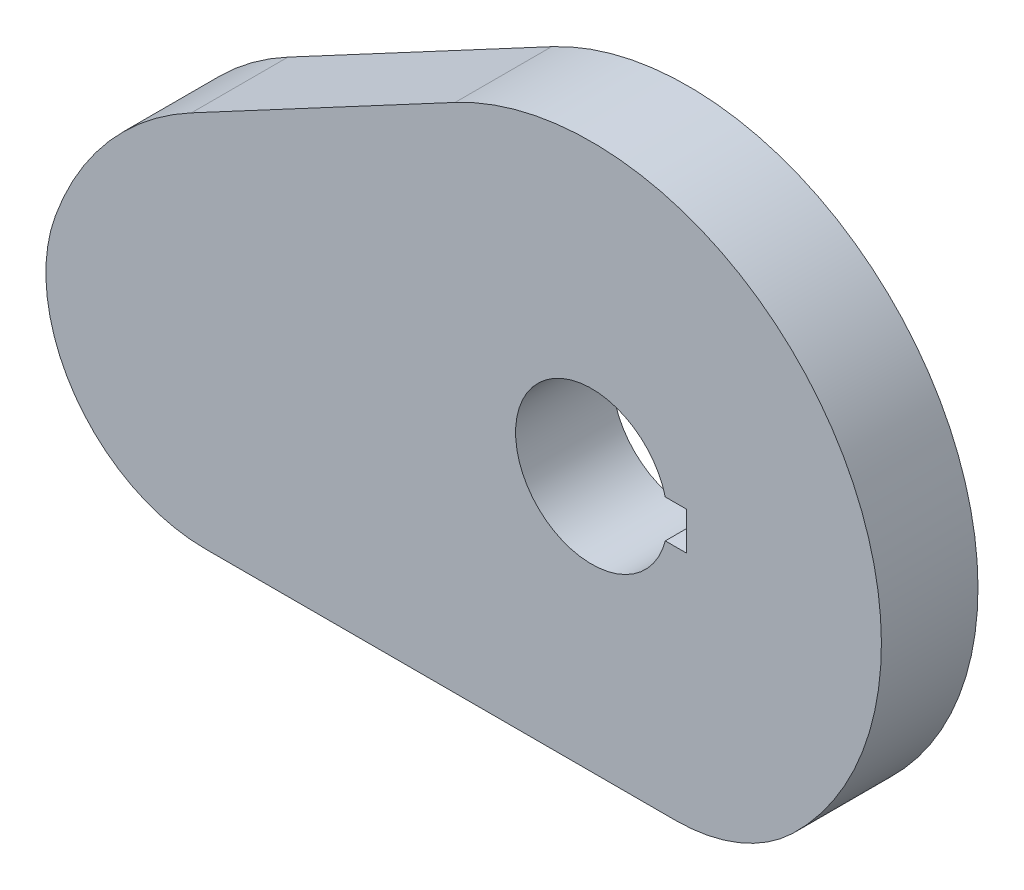
ISO-10303-21;
HEADER;
FILE_DESCRIPTION(('STEP AP214'),'2;1');
FILE_NAME('part.step','',(''),(''),'','','');
FILE_SCHEMA(('AUTOMOTIVE_DESIGN { 1 0 10303 214 1 1 1 1 }'));
ENDSEC;
DATA;
#1=APPLICATION_CONTEXT('core data for automotive mechanical design processes');
#2=APPLICATION_PROTOCOL_DEFINITION('international standard','automotive_design',2000,#1);
#3=PRODUCT_CONTEXT('',#1,'mechanical');
#4=PRODUCT('Part','Part','',(#3));
#5=PRODUCT_RELATED_PRODUCT_CATEGORY('part','',(#4));
#6=PRODUCT_DEFINITION_FORMATION('','',#4);
#7=PRODUCT_DEFINITION_CONTEXT('part definition',#1,'design');
#8=PRODUCT_DEFINITION('design','',#6,#7);
#9=PRODUCT_DEFINITION_SHAPE('','',#8);
#10=(LENGTH_UNIT() NAMED_UNIT(*) SI_UNIT(.MILLI.,.METRE.));
#11=(NAMED_UNIT(*) PLANE_ANGLE_UNIT() SI_UNIT($,.RADIAN.));
#12=(NAMED_UNIT(*) SI_UNIT($,.STERADIAN.) SOLID_ANGLE_UNIT());
#13=UNCERTAINTY_MEASURE_WITH_UNIT(LENGTH_MEASURE(1.E-05),#10,'distance_accuracy_value','');
#14=(GEOMETRIC_REPRESENTATION_CONTEXT(3) GLOBAL_UNCERTAINTY_ASSIGNED_CONTEXT((#13)) GLOBAL_UNIT_ASSIGNED_CONTEXT((#10,
#11,#12)) REPRESENTATION_CONTEXT('',''));
#15=CARTESIAN_POINT('',(0.,0.,0.));
#16=DIRECTION('',(0.,0.,1.));
#17=DIRECTION('',(1.,0.,0.));
#18=AXIS2_PLACEMENT_3D('',#15,#16,#17);
#19=CARTESIAN_POINT('',(-69.3498008308314,-37.0502683895676,12.7));
#20=DIRECTION('',(0.,0.,1.));
#21=DIRECTION('',(1.,0.,0.));
#22=AXIS2_PLACEMENT_3D('',#19,#20,#21);
#23=PLANE('',#22);
#24=CARTESIAN_POINT('',(-69.3498008308314,-37.0502683895676,12.7));
#25=DIRECTION('',(0.,0.,1.));
#26=DIRECTION('',(1.,0.,0.));
#27=AXIS2_PLACEMENT_3D('',#24,#25,#26);
#28=CIRCLE('',#27,76.2);
#29=CARTESIAN_POINT('',(-105.256684145707,30.1593717717358,12.7));
#30=VERTEX_POINT('',#29);
#31=CARTESIAN_POINT('',(-141.01691009565,-11.1607830794174,12.7));
#32=VERTEX_POINT('',#31);
#33=EDGE_CURVE('E150',#30,#32,#28,.T.);
#34=ORIENTED_EDGE('',*,*,#33,.T.);
#35=CARTESIAN_POINT('',(-101.6,-25.4,12.7));
#36=DIRECTION('',(0.,0.,1.));
#37=DIRECTION('',(1.,0.,0.));
#38=AXIS2_PLACEMENT_3D('',#35,#36,#37);
#39=CIRCLE('',#38,41.91);
#40=CARTESIAN_POINT('',(-101.6,-67.31,12.7));
#41=VERTEX_POINT('',#40);
#42=EDGE_CURVE('E153',#32,#41,#39,.T.);
#43=ORIENTED_EDGE('',*,*,#42,.T.);
#44=DIRECTION('',(1.,0.,0.));
#45=VECTOR('',#44,1.);
#46=CARTESIAN_POINT('',(-101.6,-67.31,12.7));
#47=LINE('',#46,#45);
#48=CARTESIAN_POINT('',(22.0336764975798,-67.31,12.7));
#49=VERTEX_POINT('',#48);
#50=EDGE_CURVE('E156',#41,#49,#47,.T.);
#51=ORIENTED_EDGE('',*,*,#50,.T.);
#52=CARTESIAN_POINT('',(22.0336764975798,-22.86,12.7));
#53=DIRECTION('',(0.,0.,1.));
#54=DIRECTION('',(1.,0.,0.));
#55=AXIS2_PLACEMENT_3D('',#52,#53,#54);
#56=CIRCLE('',#55,44.45);
#57=CARTESIAN_POINT('',(52.8808235941915,-54.864,12.7));
#58=VERTEX_POINT('',#57);
#59=EDGE_CURVE('E158',#49,#58,#56,.T.);
#60=ORIENTED_EDGE('',*,*,#59,.T.);
#61=CARTESIAN_POINT('',(0.,0.,12.7));
#62=DIRECTION('',(0.,0.,1.));
#63=DIRECTION('',(-1.,0.,0.));
#64=AXIS2_PLACEMENT_3D('',#61,#62,#63);
#65=CIRCLE('',#64,76.2);
#66=CARTESIAN_POINT('',(-35.906883314876,67.2096401613034,12.7));
#67=VERTEX_POINT('',#66);
#68=EDGE_CURVE('E160',#58,#67,#65,.T.);
#69=ORIENTED_EDGE('',*,*,#68,.T.);
#70=DIRECTION('',(-0.882016275082722,-0.471218941140104,0.));
#71=VECTOR('',#70,1.);
#72=CARTESIAN_POINT('',(-105.256684145707,30.1593717717358,12.7));
#73=LINE('',#72,#71);
#74=EDGE_CURVE('E162',#67,#30,#73,.T.);
#75=ORIENTED_EDGE('',*,*,#74,.T.);
#76=EDGE_LOOP('',(#34,#43,#51,#60,#69,#75));
#77=FACE_BOUND('',#76,.T.);
#78=DIRECTION('',(-1.,0.,0.));
#79=VECTOR('',#78,1.);
#80=CARTESIAN_POINT('',(19.3649167310371,5.,12.7));
#81=LINE('',#80,#79);
#82=CARTESIAN_POINT('',(25.,5.,12.7));
#83=VERTEX_POINT('',#82);
#84=CARTESIAN_POINT('',(19.3649167310371,5.,12.7));
#85=VERTEX_POINT('',#84);
#86=EDGE_CURVE('E122',#83,#85,#81,.T.);
#87=ORIENTED_EDGE('',*,*,#86,.F.);
#88=DIRECTION('',(0.,1.,0.));
#89=VECTOR('',#88,1.);
#90=CARTESIAN_POINT('',(25.,5.,12.7));
#91=LINE('',#90,#89);
#92=CARTESIAN_POINT('',(25.,-5.,12.7));
#93=VERTEX_POINT('',#92);
#94=EDGE_CURVE('E114',#93,#83,#91,.T.);
#95=ORIENTED_EDGE('',*,*,#94,.F.);
#96=DIRECTION('',(1.,0.,0.));
#97=VECTOR('',#96,1.);
#98=CARTESIAN_POINT('',(19.3649167310371,-5.,12.7));
#99=LINE('',#98,#97);
#100=CARTESIAN_POINT('',(19.3649167310371,-5.,12.7));
#101=VERTEX_POINT('',#100);
#102=EDGE_CURVE('E136',#101,#93,#99,.T.);
#103=ORIENTED_EDGE('',*,*,#102,.F.);
#104=CARTESIAN_POINT('',(0.,0.,12.7));
#105=DIRECTION('',(0.,0.,1.));
#106=DIRECTION('',(1.,0.,0.));
#107=AXIS2_PLACEMENT_3D('',#104,#105,#106);
#108=CIRCLE('',#107,20.);
#109=EDGE_CURVE('E134',#85,#101,#108,.T.);
#110=ORIENTED_EDGE('',*,*,#109,.F.);
#111=EDGE_LOOP('',(#87,#95,#103,#110));
#112=FACE_BOUND('',#111,.T.);
#113=ADVANCED_FACE('F37',(#77,#112),#23,.T.);
#114=CARTESIAN_POINT('',(-69.3498008308314,-37.0502683895676,-12.7));
#115=DIRECTION('',(0.,0.,1.));
#116=DIRECTION('',(1.,0.,0.));
#117=AXIS2_PLACEMENT_3D('',#114,#115,#116);
#118=PLANE('',#117);
#119=CARTESIAN_POINT('',(-69.3498008308314,-37.0502683895676,-12.7));
#120=DIRECTION('',(0.,0.,1.));
#121=DIRECTION('',(1.,0.,0.));
#122=AXIS2_PLACEMENT_3D('',#119,#120,#121);
#123=CIRCLE('',#122,76.2);
#124=CARTESIAN_POINT('',(-105.256684145707,30.1593717717358,-12.7));
#125=VERTEX_POINT('',#124);
#126=CARTESIAN_POINT('',(-141.01691009565,-11.1607830794174,-12.7));
#127=VERTEX_POINT('',#126);
#128=EDGE_CURVE('E130',#125,#127,#123,.T.);
#129=ORIENTED_EDGE('',*,*,#128,.F.);
#130=DIRECTION('',(-0.882016275082722,-0.471218941140104,0.));
#131=VECTOR('',#130,1.);
#132=CARTESIAN_POINT('',(-105.256684145707,30.1593717717358,-12.7));
#133=LINE('',#132,#131);
#134=CARTESIAN_POINT('',(-35.906883314876,67.2096401613034,-12.7));
#135=VERTEX_POINT('',#134);
#136=EDGE_CURVE('E154',#135,#125,#133,.T.);
#137=ORIENTED_EDGE('',*,*,#136,.F.);
#138=CARTESIAN_POINT('',(0.,0.,-12.7));
#139=DIRECTION('',(0.,0.,1.));
#140=DIRECTION('',(-1.,0.,0.));
#141=AXIS2_PLACEMENT_3D('',#138,#139,#140);
#142=CIRCLE('',#141,76.2);
#143=CARTESIAN_POINT('',(52.8808235941915,-54.864,-12.7));
#144=VERTEX_POINT('',#143);
#145=EDGE_CURVE('E174',#144,#135,#142,.T.);
#146=ORIENTED_EDGE('',*,*,#145,.F.);
#147=CARTESIAN_POINT('',(22.0336764975798,-22.86,-12.7));
#148=DIRECTION('',(0.,0.,1.));
#149=DIRECTION('',(1.,0.,0.));
#150=AXIS2_PLACEMENT_3D('',#147,#148,#149);
#151=CIRCLE('',#150,44.45);
#152=CARTESIAN_POINT('',(22.0336764975798,-67.31,-12.7));
#153=VERTEX_POINT('',#152);
#154=EDGE_CURVE('E171',#153,#144,#151,.T.);
#155=ORIENTED_EDGE('',*,*,#154,.F.);
#156=DIRECTION('',(1.,0.,0.));
#157=VECTOR('',#156,1.);
#158=CARTESIAN_POINT('',(-101.6,-67.31,-12.7));
#159=LINE('',#158,#157);
#160=CARTESIAN_POINT('',(-101.6,-67.31,-12.7));
#161=VERTEX_POINT('',#160);
#162=EDGE_CURVE('E169',#161,#153,#159,.T.);
#163=ORIENTED_EDGE('',*,*,#162,.F.);
#164=CARTESIAN_POINT('',(-101.6,-25.4,-12.7));
#165=DIRECTION('',(0.,0.,1.));
#166=DIRECTION('',(1.,0.,0.));
#167=AXIS2_PLACEMENT_3D('',#164,#165,#166);
#168=CIRCLE('',#167,41.91);
#169=EDGE_CURVE('E167',#127,#161,#168,.T.);
#170=ORIENTED_EDGE('',*,*,#169,.F.);
#171=EDGE_LOOP('',(#129,#137,#146,#155,#163,#170));
#172=FACE_BOUND('',#171,.T.);
#173=DIRECTION('',(0.,1.,0.));
#174=VECTOR('',#173,1.);
#175=CARTESIAN_POINT('',(25.,5.,-12.7));
#176=LINE('',#175,#174);
#177=CARTESIAN_POINT('',(25.,-5.,-12.7));
#178=VERTEX_POINT('',#177);
#179=CARTESIAN_POINT('',(25.,5.,-12.7));
#180=VERTEX_POINT('',#179);
#181=EDGE_CURVE('E60',#178,#180,#176,.T.);
#182=ORIENTED_EDGE('',*,*,#181,.T.);
#183=DIRECTION('',(-1.,0.,0.));
#184=VECTOR('',#183,1.);
#185=CARTESIAN_POINT('',(19.3649167310371,5.,-12.7));
#186=LINE('',#185,#184);
#187=CARTESIAN_POINT('',(19.3649167310371,5.,-12.7));
#188=VERTEX_POINT('',#187);
#189=EDGE_CURVE('E129',#180,#188,#186,.T.);
#190=ORIENTED_EDGE('',*,*,#189,.T.);
#191=CARTESIAN_POINT('',(0.,0.,-12.7));
#192=DIRECTION('',(0.,0.,1.));
#193=DIRECTION('',(1.,0.,0.));
#194=AXIS2_PLACEMENT_3D('',#191,#192,#193);
#195=CIRCLE('',#194,20.);
#196=CARTESIAN_POINT('',(19.3649167310371,-5.,-12.7));
#197=VERTEX_POINT('',#196);
#198=EDGE_CURVE('E142',#188,#197,#195,.T.);
#199=ORIENTED_EDGE('',*,*,#198,.T.);
#200=DIRECTION('',(1.,0.,0.));
#201=VECTOR('',#200,1.);
#202=CARTESIAN_POINT('',(19.3649167310371,-5.,-12.7));
#203=LINE('',#202,#201);
#204=EDGE_CURVE('E123',#197,#178,#203,.T.);
#205=ORIENTED_EDGE('',*,*,#204,.T.);
#206=EDGE_LOOP('',(#182,#190,#199,#205));
#207=FACE_BOUND('',#206,.T.);
#208=ADVANCED_FACE('F198',(#172,#207),#118,.F.);
#209=CARTESIAN_POINT('',(-69.3498008308314,-37.0502683895676,12.7));
#210=DIRECTION('',(0.,0.,-1.));
#211=DIRECTION('',(-1.,0.,0.));
#212=AXIS2_PLACEMENT_3D('',#209,#210,#211);
#213=CYLINDRICAL_SURFACE('',#212,76.2);
#214=ORIENTED_EDGE('',*,*,#128,.T.);
#215=DIRECTION('',(0.,0.,-1.));
#216=VECTOR('',#215,1.);
#217=CARTESIAN_POINT('',(-141.01691009565,-11.1607830794174,12.7));
#218=LINE('',#217,#216);
#219=EDGE_CURVE('E11',#32,#127,#218,.T.);
#220=ORIENTED_EDGE('',*,*,#219,.F.);
#221=ORIENTED_EDGE('',*,*,#33,.F.);
#222=DIRECTION('',(0.,0.,-1.));
#223=VECTOR('',#222,1.);
#224=CARTESIAN_POINT('',(-105.256684145707,30.1593717717358,12.7));
#225=LINE('',#224,#223);
#226=EDGE_CURVE('E164',#30,#125,#225,.T.);
#227=ORIENTED_EDGE('',*,*,#226,.T.);
#228=EDGE_LOOP('',(#214,#220,#221,#227));
#229=FACE_BOUND('',#228,.T.);
#230=ADVANCED_FACE('F39',(#229),#213,.T.);
#231=CARTESIAN_POINT('',(-101.6,-25.4,12.7));
#232=DIRECTION('',(0.,0.,-1.));
#233=DIRECTION('',(-1.,0.,0.));
#234=AXIS2_PLACEMENT_3D('',#231,#232,#233);
#235=CYLINDRICAL_SURFACE('',#234,41.91);
#236=ORIENTED_EDGE('',*,*,#169,.T.);
#237=DIRECTION('',(0.,0.,-1.));
#238=VECTOR('',#237,1.);
#239=CARTESIAN_POINT('',(-101.6,-67.31,12.7));
#240=LINE('',#239,#238);
#241=EDGE_CURVE('E45',#41,#161,#240,.T.);
#242=ORIENTED_EDGE('',*,*,#241,.F.);
#243=ORIENTED_EDGE('',*,*,#42,.F.);
#244=ORIENTED_EDGE('',*,*,#219,.T.);
#245=EDGE_LOOP('',(#236,#242,#243,#244));
#246=FACE_BOUND('',#245,.T.);
#247=ADVANCED_FACE('F214',(#246),#235,.T.);
#248=CARTESIAN_POINT('',(-101.6,-67.31,12.7));
#249=DIRECTION('',(0.,1.,0.));
#250=DIRECTION('',(-1.,0.,0.));
#251=AXIS2_PLACEMENT_3D('',#248,#249,#250);
#252=PLANE('',#251);
#253=ORIENTED_EDGE('',*,*,#162,.T.);
#254=DIRECTION('',(0.,0.,-1.));
#255=VECTOR('',#254,1.);
#256=CARTESIAN_POINT('',(22.0336764975798,-67.31,12.7));
#257=LINE('',#256,#255);
#258=EDGE_CURVE('E185',#49,#153,#257,.T.);
#259=ORIENTED_EDGE('',*,*,#258,.F.);
#260=ORIENTED_EDGE('',*,*,#50,.F.);
#261=ORIENTED_EDGE('',*,*,#241,.T.);
#262=EDGE_LOOP('',(#253,#259,#260,#261));
#263=FACE_BOUND('',#262,.T.);
#264=ADVANCED_FACE('F192',(#263),#252,.F.);
#265=CARTESIAN_POINT('',(22.0336764975798,-22.86,12.7));
#266=DIRECTION('',(0.,0.,-1.));
#267=DIRECTION('',(-1.,0.,0.));
#268=AXIS2_PLACEMENT_3D('',#265,#266,#267);
#269=CYLINDRICAL_SURFACE('',#268,44.45);
#270=ORIENTED_EDGE('',*,*,#154,.T.);
#271=DIRECTION('',(0.,0.,-1.));
#272=VECTOR('',#271,1.);
#273=CARTESIAN_POINT('',(52.8808235941915,-54.864,12.7));
#274=LINE('',#273,#272);
#275=EDGE_CURVE('E182',#58,#144,#274,.T.);
#276=ORIENTED_EDGE('',*,*,#275,.F.);
#277=ORIENTED_EDGE('',*,*,#59,.F.);
#278=ORIENTED_EDGE('',*,*,#258,.T.);
#279=EDGE_LOOP('',(#270,#276,#277,#278));
#280=FACE_BOUND('',#279,.T.);
#281=ADVANCED_FACE('F203',(#280),#269,.T.);
#282=CARTESIAN_POINT('',(0.,0.,12.7));
#283=DIRECTION('',(0.,0.,-1.));
#284=DIRECTION('',(-1.,0.,0.));
#285=AXIS2_PLACEMENT_3D('',#282,#283,#284);
#286=CYLINDRICAL_SURFACE('',#285,76.2);
#287=ORIENTED_EDGE('',*,*,#145,.T.);
#288=DIRECTION('',(0.,0.,-1.));
#289=VECTOR('',#288,1.);
#290=CARTESIAN_POINT('',(-35.906883314876,67.2096401613034,12.7));
#291=LINE('',#290,#289);
#292=EDGE_CURVE('E179',#67,#135,#291,.T.);
#293=ORIENTED_EDGE('',*,*,#292,.F.);
#294=ORIENTED_EDGE('',*,*,#68,.F.);
#295=ORIENTED_EDGE('',*,*,#275,.T.);
#296=EDGE_LOOP('',(#287,#293,#294,#295));
#297=FACE_BOUND('',#296,.T.);
#298=ADVANCED_FACE('F207',(#297),#286,.T.);
#299=CARTESIAN_POINT('',(-105.256684145707,30.1593717717358,12.7));
#300=DIRECTION('',(0.471218941140104,-0.882016275082721,0.));
#301=DIRECTION('',(0.882016275082722,0.471218941140104,0.));
#302=AXIS2_PLACEMENT_3D('',#299,#300,#301);
#303=PLANE('',#302);
#304=ORIENTED_EDGE('',*,*,#136,.T.);
#305=ORIENTED_EDGE('',*,*,#226,.F.);
#306=ORIENTED_EDGE('',*,*,#74,.F.);
#307=ORIENTED_EDGE('',*,*,#292,.T.);
#308=EDGE_LOOP('',(#304,#305,#306,#307));
#309=FACE_BOUND('',#308,.T.);
#310=ADVANCED_FACE('F217',(#309),#303,.F.);
#311=CARTESIAN_POINT('',(25.,5.,12.7));
#312=DIRECTION('',(-1.,0.,0.));
#313=DIRECTION('',(0.,0.,1.));
#314=AXIS2_PLACEMENT_3D('',#311,#312,#313);
#315=PLANE('',#314);
#316=ORIENTED_EDGE('',*,*,#181,.F.);
#317=DIRECTION('',(0.,0.,-1.));
#318=VECTOR('',#317,1.);
#319=CARTESIAN_POINT('',(25.,-5.,12.7));
#320=LINE('',#319,#318);
#321=EDGE_CURVE('E118',#93,#178,#320,.T.);
#322=ORIENTED_EDGE('',*,*,#321,.F.);
#323=ORIENTED_EDGE('',*,*,#94,.T.);
#324=DIRECTION('',(0.,0.,-1.));
#325=VECTOR('',#324,1.);
#326=CARTESIAN_POINT('',(25.,5.,12.7));
#327=LINE('',#326,#325);
#328=EDGE_CURVE('E117',#83,#180,#327,.T.);
#329=ORIENTED_EDGE('',*,*,#328,.T.);
#330=EDGE_LOOP('',(#316,#322,#323,#329));
#331=FACE_BOUND('',#330,.T.);
#332=ADVANCED_FACE('F116',(#331),#315,.T.);
#333=CARTESIAN_POINT('',(19.3649167310371,5.,12.7));
#334=DIRECTION('',(0.,-1.,0.));
#335=DIRECTION('',(0.,0.,-1.));
#336=AXIS2_PLACEMENT_3D('',#333,#334,#335);
#337=PLANE('',#336);
#338=ORIENTED_EDGE('',*,*,#189,.F.);
#339=ORIENTED_EDGE('',*,*,#328,.F.);
#340=ORIENTED_EDGE('',*,*,#86,.T.);
#341=DIRECTION('',(0.,0.,-1.));
#342=VECTOR('',#341,1.);
#343=CARTESIAN_POINT('',(19.3649167310371,5.,12.7));
#344=LINE('',#343,#342);
#345=EDGE_CURVE('E131',#85,#188,#344,.T.);
#346=ORIENTED_EDGE('',*,*,#345,.T.);
#347=EDGE_LOOP('',(#338,#339,#340,#346));
#348=FACE_BOUND('',#347,.T.);
#349=ADVANCED_FACE('F126',(#348),#337,.T.);
#350=CARTESIAN_POINT('',(0.,0.,12.7));
#351=DIRECTION('',(0.,0.,-1.));
#352=DIRECTION('',(-1.,0.,0.));
#353=AXIS2_PLACEMENT_3D('',#350,#351,#352);
#354=CYLINDRICAL_SURFACE('',#353,20.);
#355=ORIENTED_EDGE('',*,*,#198,.F.);
#356=ORIENTED_EDGE('',*,*,#345,.F.);
#357=ORIENTED_EDGE('',*,*,#109,.T.);
#358=DIRECTION('',(0.,0.,-1.));
#359=VECTOR('',#358,1.);
#360=CARTESIAN_POINT('',(19.3649167310371,-5.,12.7));
#361=LINE('',#360,#359);
#362=EDGE_CURVE('E52',#101,#197,#361,.T.);
#363=ORIENTED_EDGE('',*,*,#362,.T.);
#364=EDGE_LOOP('',(#355,#356,#357,#363));
#365=FACE_BOUND('',#364,.T.);
#366=ADVANCED_FACE('F235',(#365),#354,.F.);
#367=CARTESIAN_POINT('',(19.3649167310371,-5.,12.7));
#368=DIRECTION('',(0.,1.,0.));
#369=DIRECTION('',(0.,0.,1.));
#370=AXIS2_PLACEMENT_3D('',#367,#368,#369);
#371=PLANE('',#370);
#372=ORIENTED_EDGE('',*,*,#204,.F.);
#373=ORIENTED_EDGE('',*,*,#362,.F.);
#374=ORIENTED_EDGE('',*,*,#102,.T.);
#375=ORIENTED_EDGE('',*,*,#321,.T.);
#376=EDGE_LOOP('',(#372,#373,#374,#375));
#377=FACE_BOUND('',#376,.T.);
#378=ADVANCED_FACE('F238',(#377),#371,.T.);
#379=CLOSED_SHELL('',(#113,#208,#230,#247,#264,#281,#298,#310,#332,#349,#366,#378));
#380=MANIFOLD_SOLID_BREP('B2',#379);
#381=ADVANCED_BREP_SHAPE_REPRESENTATION('',(#18,#380),#14);
#382=SHAPE_DEFINITION_REPRESENTATION(#9,#381);
ENDSEC;
END-ISO-10303-21;
